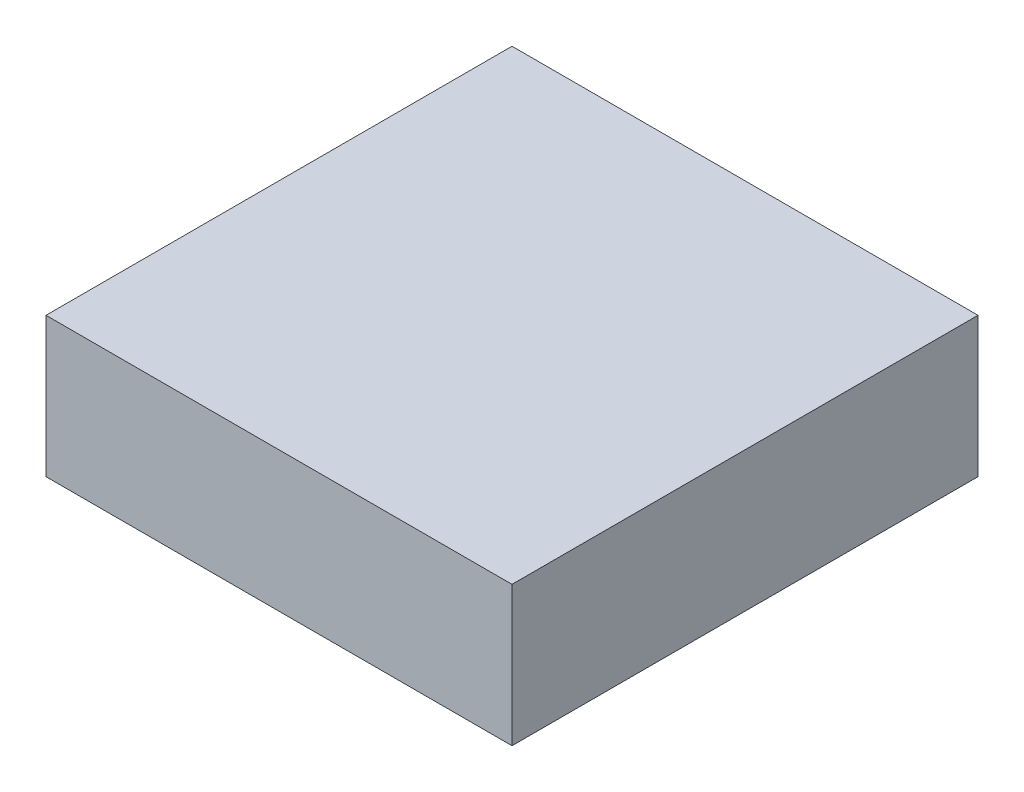
ISO-10303-21;
HEADER;
FILE_DESCRIPTION(('STEP AP214'),'2;1');
FILE_NAME('part.step','',(''),(''),'','','');
FILE_SCHEMA(('AUTOMOTIVE_DESIGN { 1 0 10303 214 1 1 1 1 }'));
ENDSEC;
DATA;
#1=APPLICATION_CONTEXT('core data for automotive mechanical design processes');
#2=APPLICATION_PROTOCOL_DEFINITION('international standard','automotive_design',2000,#1);
#3=PRODUCT_CONTEXT('',#1,'mechanical');
#4=PRODUCT('Part','Part','',(#3));
#5=PRODUCT_RELATED_PRODUCT_CATEGORY('part','',(#4));
#6=PRODUCT_DEFINITION_FORMATION('','',#4);
#7=PRODUCT_DEFINITION_CONTEXT('part definition',#1,'design');
#8=PRODUCT_DEFINITION('design','',#6,#7);
#9=PRODUCT_DEFINITION_SHAPE('','',#8);
#10=(LENGTH_UNIT() NAMED_UNIT(*) SI_UNIT(.MILLI.,.METRE.));
#11=(NAMED_UNIT(*) PLANE_ANGLE_UNIT() SI_UNIT($,.RADIAN.));
#12=(NAMED_UNIT(*) SI_UNIT($,.STERADIAN.) SOLID_ANGLE_UNIT());
#13=UNCERTAINTY_MEASURE_WITH_UNIT(LENGTH_MEASURE(1.E-05),#10,'distance_accuracy_value','');
#14=(GEOMETRIC_REPRESENTATION_CONTEXT(3) GLOBAL_UNCERTAINTY_ASSIGNED_CONTEXT((#13)) GLOBAL_UNIT_ASSIGNED_CONTEXT((#10,
#11,#12)) REPRESENTATION_CONTEXT('',''));
#15=CARTESIAN_POINT('',(0.,0.,0.));
#16=DIRECTION('',(0.,0.,1.));
#17=DIRECTION('',(1.,0.,0.));
#18=AXIS2_PLACEMENT_3D('',#15,#16,#17);
#19=CARTESIAN_POINT('',(250.,150.,250.));
#20=DIRECTION('',(-1.,0.,0.));
#21=DIRECTION('',(0.,0.,1.));
#22=AXIS2_PLACEMENT_3D('',#19,#20,#21);
#23=PLANE('',#22);
#24=DIRECTION('',(0.,0.,-1.));
#25=VECTOR('',#24,1.);
#26=CARTESIAN_POINT('',(250.,0.,250.));
#27=LINE('',#26,#25);
#28=CARTESIAN_POINT('',(250.,0.,250.));
#29=VERTEX_POINT('',#28);
#30=CARTESIAN_POINT('',(250.,0.,-250.));
#31=VERTEX_POINT('',#30);
#32=EDGE_CURVE('E96',#29,#31,#27,.T.);
#33=ORIENTED_EDGE('',*,*,#32,.T.);
#34=DIRECTION('',(0.,-1.,0.));
#35=VECTOR('',#34,1.);
#36=CARTESIAN_POINT('',(250.,150.,-250.));
#37=LINE('',#36,#35);
#38=CARTESIAN_POINT('',(250.,150.,-250.));
#39=VERTEX_POINT('',#38);
#40=EDGE_CURVE('E11',#39,#31,#37,.T.);
#41=ORIENTED_EDGE('',*,*,#40,.F.);
#42=DIRECTION('',(0.,0.,-1.));
#43=VECTOR('',#42,1.);
#44=CARTESIAN_POINT('',(250.,150.,250.));
#45=LINE('',#44,#43);
#46=CARTESIAN_POINT('',(250.,150.,250.));
#47=VERTEX_POINT('',#46);
#48=EDGE_CURVE('E84',#47,#39,#45,.T.);
#49=ORIENTED_EDGE('',*,*,#48,.F.);
#50=DIRECTION('',(0.,-1.,0.));
#51=VECTOR('',#50,1.);
#52=CARTESIAN_POINT('',(250.,150.,250.));
#53=LINE('',#52,#51);
#54=EDGE_CURVE('E92',#47,#29,#53,.T.);
#55=ORIENTED_EDGE('',*,*,#54,.T.);
#56=EDGE_LOOP('',(#33,#41,#49,#55));
#57=FACE_BOUND('',#56,.T.);
#58=ADVANCED_FACE('F33',(#57),#23,.F.);
#59=CARTESIAN_POINT('',(-250.,150.,-250.));
#60=DIRECTION('',(0.,0.,1.));
#61=DIRECTION('',(1.,0.,0.));
#62=AXIS2_PLACEMENT_3D('',#59,#60,#61);
#63=PLANE('',#62);
#64=DIRECTION('',(-1.,0.,0.));
#65=VECTOR('',#64,1.);
#66=CARTESIAN_POINT('',(-250.,0.,-250.));
#67=LINE('',#66,#65);
#68=CARTESIAN_POINT('',(-250.,0.,-250.));
#69=VERTEX_POINT('',#68);
#70=EDGE_CURVE('E88',#31,#69,#67,.T.);
#71=ORIENTED_EDGE('',*,*,#70,.T.);
#72=DIRECTION('',(0.,-1.,0.));
#73=VECTOR('',#72,1.);
#74=CARTESIAN_POINT('',(-250.,150.,-250.));
#75=LINE('',#74,#73);
#76=CARTESIAN_POINT('',(-250.,150.,-250.));
#77=VERTEX_POINT('',#76);
#78=EDGE_CURVE('E41',#77,#69,#75,.T.);
#79=ORIENTED_EDGE('',*,*,#78,.F.);
#80=DIRECTION('',(-1.,0.,0.));
#81=VECTOR('',#80,1.);
#82=CARTESIAN_POINT('',(-250.,150.,-250.));
#83=LINE('',#82,#81);
#84=EDGE_CURVE('E79',#39,#77,#83,.T.);
#85=ORIENTED_EDGE('',*,*,#84,.F.);
#86=ORIENTED_EDGE('',*,*,#40,.T.);
#87=EDGE_LOOP('',(#71,#79,#85,#86));
#88=FACE_BOUND('',#87,.T.);
#89=ADVANCED_FACE('F87',(#88),#63,.F.);
#90=CARTESIAN_POINT('',(-250.,150.,250.));
#91=DIRECTION('',(1.,0.,0.));
#92=DIRECTION('',(0.,0.,-1.));
#93=AXIS2_PLACEMENT_3D('',#90,#91,#92);
#94=PLANE('',#93);
#95=DIRECTION('',(0.,0.,1.));
#96=VECTOR('',#95,1.);
#97=CARTESIAN_POINT('',(-250.,0.,250.));
#98=LINE('',#97,#96);
#99=CARTESIAN_POINT('',(-250.,0.,250.));
#100=VERTEX_POINT('',#99);
#101=EDGE_CURVE('E66',#69,#100,#98,.T.);
#102=ORIENTED_EDGE('',*,*,#101,.T.);
#103=DIRECTION('',(0.,-1.,0.));
#104=VECTOR('',#103,1.);
#105=CARTESIAN_POINT('',(-250.,150.,250.));
#106=LINE('',#105,#104);
#107=CARTESIAN_POINT('',(-250.,150.,250.));
#108=VERTEX_POINT('',#107);
#109=EDGE_CURVE('E89',#108,#100,#106,.T.);
#110=ORIENTED_EDGE('',*,*,#109,.F.);
#111=DIRECTION('',(0.,0.,1.));
#112=VECTOR('',#111,1.);
#113=CARTESIAN_POINT('',(-250.,150.,250.));
#114=LINE('',#113,#112);
#115=EDGE_CURVE('E82',#77,#108,#114,.T.);
#116=ORIENTED_EDGE('',*,*,#115,.F.);
#117=ORIENTED_EDGE('',*,*,#78,.T.);
#118=EDGE_LOOP('',(#102,#110,#116,#117));
#119=FACE_BOUND('',#118,.T.);
#120=ADVANCED_FACE('F90',(#119),#94,.F.);
#121=CARTESIAN_POINT('',(-250.,150.,250.));
#122=DIRECTION('',(0.,0.,-1.));
#123=DIRECTION('',(-1.,0.,0.));
#124=AXIS2_PLACEMENT_3D('',#121,#122,#123);
#125=PLANE('',#124);
#126=DIRECTION('',(1.,0.,0.));
#127=VECTOR('',#126,1.);
#128=CARTESIAN_POINT('',(-250.,0.,250.));
#129=LINE('',#128,#127);
#130=EDGE_CURVE('E72',#100,#29,#129,.T.);
#131=ORIENTED_EDGE('',*,*,#130,.T.);
#132=ORIENTED_EDGE('',*,*,#54,.F.);
#133=DIRECTION('',(1.,0.,0.));
#134=VECTOR('',#133,1.);
#135=CARTESIAN_POINT('',(-250.,150.,250.));
#136=LINE('',#135,#134);
#137=EDGE_CURVE('E49',#108,#47,#136,.T.);
#138=ORIENTED_EDGE('',*,*,#137,.F.);
#139=ORIENTED_EDGE('',*,*,#109,.T.);
#140=EDGE_LOOP('',(#131,#132,#138,#139));
#141=FACE_BOUND('',#140,.T.);
#142=ADVANCED_FACE('F103',(#141),#125,.F.);
#143=CARTESIAN_POINT('',(0.,150.,0.));
#144=DIRECTION('',(0.,-1.,0.));
#145=DIRECTION('',(0.,0.,-1.));
#146=AXIS2_PLACEMENT_3D('',#143,#144,#145);
#147=PLANE('',#146);
#148=ORIENTED_EDGE('',*,*,#48,.T.);
#149=ORIENTED_EDGE('',*,*,#84,.T.);
#150=ORIENTED_EDGE('',*,*,#115,.T.);
#151=ORIENTED_EDGE('',*,*,#137,.T.);
#152=EDGE_LOOP('',(#148,#149,#150,#151));
#153=FACE_BOUND('',#152,.T.);
#154=ADVANCED_FACE('F80',(#153),#147,.F.);
#155=CARTESIAN_POINT('',(0.,0.,0.));
#156=DIRECTION('',(0.,-1.,0.));
#157=DIRECTION('',(0.,0.,-1.));
#158=AXIS2_PLACEMENT_3D('',#155,#156,#157);
#159=PLANE('',#158);
#160=ORIENTED_EDGE('',*,*,#32,.F.);
#161=ORIENTED_EDGE('',*,*,#130,.F.);
#162=ORIENTED_EDGE('',*,*,#101,.F.);
#163=ORIENTED_EDGE('',*,*,#70,.F.);
#164=EDGE_LOOP('',(#160,#161,#162,#163));
#165=FACE_BOUND('',#164,.T.);
#166=ADVANCED_FACE('F106',(#165),#159,.T.);
#167=CLOSED_SHELL('',(#58,#89,#120,#142,#154,#166));
#168=MANIFOLD_SOLID_BREP('B2',#167);
#169=ADVANCED_BREP_SHAPE_REPRESENTATION('',(#18,#168),#14);
#170=SHAPE_DEFINITION_REPRESENTATION(#9,#169);
ENDSEC;
END-ISO-10303-21;
